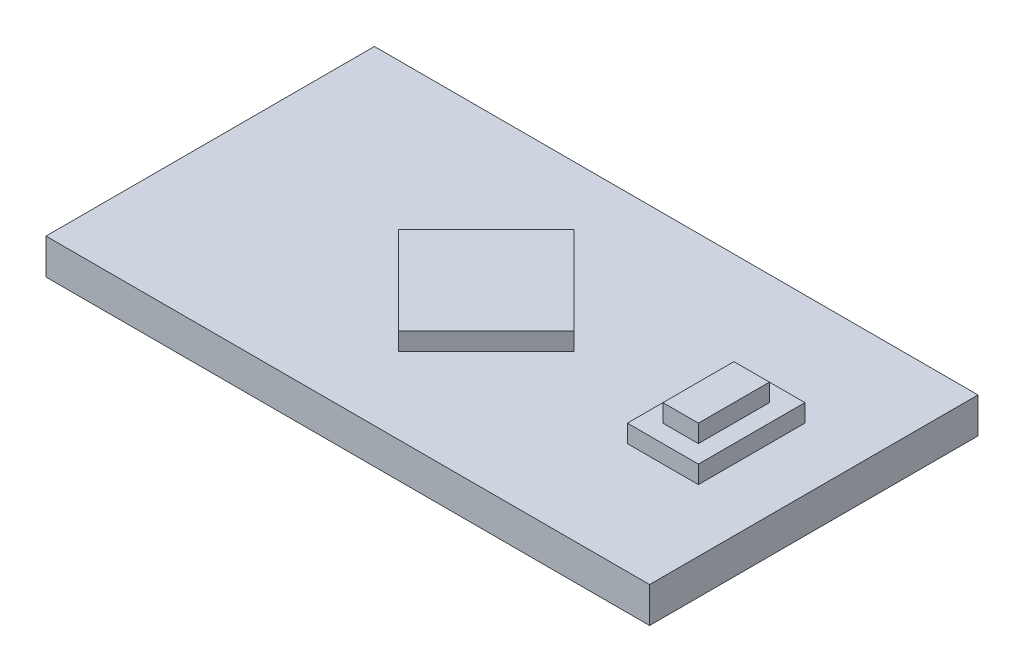
ISO-10303-21;
HEADER;
FILE_DESCRIPTION(('STEP AP214'),'2;1');
FILE_NAME('part.step','',(''),(''),'','','');
FILE_SCHEMA(('AUTOMOTIVE_DESIGN { 1 0 10303 214 1 1 1 1 }'));
ENDSEC;
DATA;
#1=APPLICATION_CONTEXT('core data for automotive mechanical design processes');
#2=APPLICATION_PROTOCOL_DEFINITION('international standard','automotive_design',2000,#1);
#3=PRODUCT_CONTEXT('',#1,'mechanical');
#4=PRODUCT('Part','Part','',(#3));
#5=PRODUCT_RELATED_PRODUCT_CATEGORY('part','',(#4));
#6=PRODUCT_DEFINITION_FORMATION('','',#4);
#7=PRODUCT_DEFINITION_CONTEXT('part definition',#1,'design');
#8=PRODUCT_DEFINITION('design','',#6,#7);
#9=PRODUCT_DEFINITION_SHAPE('','',#8);
#10=(LENGTH_UNIT() NAMED_UNIT(*) SI_UNIT(.MILLI.,.METRE.));
#11=(NAMED_UNIT(*) PLANE_ANGLE_UNIT() SI_UNIT($,.RADIAN.));
#12=(NAMED_UNIT(*) SI_UNIT($,.STERADIAN.) SOLID_ANGLE_UNIT());
#13=UNCERTAINTY_MEASURE_WITH_UNIT(LENGTH_MEASURE(1.E-05),#10,'distance_accuracy_value','');
#14=(GEOMETRIC_REPRESENTATION_CONTEXT(3) GLOBAL_UNCERTAINTY_ASSIGNED_CONTEXT((#13)) GLOBAL_UNIT_ASSIGNED_CONTEXT((#10,
#11,#12)) REPRESENTATION_CONTEXT('',''));
#15=CARTESIAN_POINT('',(0.,0.,0.));
#16=DIRECTION('',(0.,0.,1.));
#17=DIRECTION('',(1.,0.,0.));
#18=AXIS2_PLACEMENT_3D('',#15,#16,#17);
#19=CARTESIAN_POINT('',(0.,2.,0.));
#20=DIRECTION('',(0.,-1.,0.));
#21=DIRECTION('',(0.,0.,-1.));
#22=AXIS2_PLACEMENT_3D('',#19,#20,#21);
#23=PLANE('',#22);
#24=DIRECTION('',(0.,0.,-1.));
#25=VECTOR('',#24,1.);
#26=CARTESIAN_POINT('',(13.5,2.,-3.));
#27=LINE('',#26,#25);
#28=CARTESIAN_POINT('',(13.5,2.,3.));
#29=VERTEX_POINT('',#28);
#30=CARTESIAN_POINT('',(13.5,2.,-3.));
#31=VERTEX_POINT('',#30);
#32=EDGE_CURVE('E207',#29,#31,#27,.T.);
#33=ORIENTED_EDGE('',*,*,#32,.F.);
#34=DIRECTION('',(1.,0.,0.));
#35=VECTOR('',#34,1.);
#36=CARTESIAN_POINT('',(13.5,2.,3.));
#37=LINE('',#36,#35);
#38=CARTESIAN_POINT('',(9.5,2.,3.));
#39=VERTEX_POINT('',#38);
#40=EDGE_CURVE('E212',#39,#29,#37,.T.);
#41=ORIENTED_EDGE('',*,*,#40,.F.);
#42=DIRECTION('',(0.,0.,1.));
#43=VECTOR('',#42,1.);
#44=CARTESIAN_POINT('',(9.5,2.,-3.));
#45=LINE('',#44,#43);
#46=CARTESIAN_POINT('',(9.5,2.,-3.));
#47=VERTEX_POINT('',#46);
#48=EDGE_CURVE('E224',#47,#39,#45,.T.);
#49=ORIENTED_EDGE('',*,*,#48,.F.);
#50=DIRECTION('',(-1.,0.,0.));
#51=VECTOR('',#50,1.);
#52=CARTESIAN_POINT('',(13.5,2.,-3.));
#53=LINE('',#52,#51);
#54=EDGE_CURVE('E221',#31,#47,#53,.T.);
#55=ORIENTED_EDGE('',*,*,#54,.F.);
#56=EDGE_LOOP('',(#33,#41,#49,#55));
#57=FACE_BOUND('',#56,.T.);
#58=DIRECTION('',(0.,0.,1.));
#59=VECTOR('',#58,1.);
#60=CARTESIAN_POINT('',(-17.,2.,9.25));
#61=LINE('',#60,#59);
#62=CARTESIAN_POINT('',(-17.,2.,-9.25));
#63=VERTEX_POINT('',#62);
#64=CARTESIAN_POINT('',(-17.,2.,9.25));
#65=VERTEX_POINT('',#64);
#66=EDGE_CURVE('E241',#63,#65,#61,.T.);
#67=ORIENTED_EDGE('',*,*,#66,.T.);
#68=DIRECTION('',(1.,0.,0.));
#69=VECTOR('',#68,1.);
#70=CARTESIAN_POINT('',(-17.,2.,9.25));
#71=LINE('',#70,#69);
#72=CARTESIAN_POINT('',(17.,2.,9.25));
#73=VERTEX_POINT('',#72);
#74=EDGE_CURVE('E244',#65,#73,#71,.T.);
#75=ORIENTED_EDGE('',*,*,#74,.T.);
#76=DIRECTION('',(0.,0.,-1.));
#77=VECTOR('',#76,1.);
#78=CARTESIAN_POINT('',(17.,2.,9.25));
#79=LINE('',#78,#77);
#80=CARTESIAN_POINT('',(17.,2.,-9.25));
#81=VERTEX_POINT('',#80);
#82=EDGE_CURVE('E247',#73,#81,#79,.T.);
#83=ORIENTED_EDGE('',*,*,#82,.T.);
#84=DIRECTION('',(-1.,0.,0.));
#85=VECTOR('',#84,1.);
#86=CARTESIAN_POINT('',(-17.,2.,-9.25));
#87=LINE('',#86,#85);
#88=EDGE_CURVE('E249',#81,#63,#87,.T.);
#89=ORIENTED_EDGE('',*,*,#88,.T.);
#90=EDGE_LOOP('',(#67,#75,#83,#89));
#91=FACE_BOUND('',#90,.T.);
#92=DIRECTION('',(0.707106781186547,0.,-0.707106781186548));
#93=VECTOR('',#92,1.);
#94=CARTESIAN_POINT('',(3.5,2.,0.));
#95=LINE('',#94,#93);
#96=CARTESIAN_POINT('',(-1.44974746830583,2.,4.94974746830583));
#97=VERTEX_POINT('',#96);
#98=CARTESIAN_POINT('',(3.5,2.,0.));
#99=VERTEX_POINT('',#98);
#100=EDGE_CURVE('E168',#97,#99,#95,.T.);
#101=ORIENTED_EDGE('',*,*,#100,.F.);
#102=DIRECTION('',(0.707106781186548,0.,0.707106781186548));
#103=VECTOR('',#102,1.);
#104=CARTESIAN_POINT('',(-1.44974746830583,2.,4.94974746830583));
#105=LINE('',#104,#103);
#106=CARTESIAN_POINT('',(-6.39949493661166,2.,0.));
#107=VERTEX_POINT('',#106);
#108=EDGE_CURVE('E165',#107,#97,#105,.T.);
#109=ORIENTED_EDGE('',*,*,#108,.F.);
#110=DIRECTION('',(-0.707106781186547,0.,0.707106781186548));
#111=VECTOR('',#110,1.);
#112=CARTESIAN_POINT('',(-1.44974746830583,2.,-4.94974746830584));
#113=LINE('',#112,#111);
#114=CARTESIAN_POINT('',(-1.44974746830583,2.,-4.94974746830583));
#115=VERTEX_POINT('',#114);
#116=EDGE_CURVE('E55',#115,#107,#113,.T.);
#117=ORIENTED_EDGE('',*,*,#116,.F.);
#118=DIRECTION('',(-0.707106781186548,0.,-0.707106781186548));
#119=VECTOR('',#118,1.);
#120=CARTESIAN_POINT('',(3.5,2.,0.));
#121=LINE('',#120,#119);
#122=EDGE_CURVE('E50',#99,#115,#121,.T.);
#123=ORIENTED_EDGE('',*,*,#122,.F.);
#124=EDGE_LOOP('',(#101,#109,#117,#123));
#125=FACE_BOUND('',#124,.T.);
#126=ADVANCED_FACE('F35',(#57,#91,#125),#23,.F.);
#127=CARTESIAN_POINT('',(0.,3.,0.));
#128=DIRECTION('',(0.,-1.,0.));
#129=DIRECTION('',(0.,0.,-1.));
#130=AXIS2_PLACEMENT_3D('',#127,#128,#129);
#131=PLANE('',#130);
#132=DIRECTION('',(0.,0.,-1.));
#133=VECTOR('',#132,1.);
#134=CARTESIAN_POINT('',(13.5,3.,-3.));
#135=LINE('',#134,#133);
#136=CARTESIAN_POINT('',(13.5,3.,3.));
#137=VERTEX_POINT('',#136);
#138=CARTESIAN_POINT('',(13.5,3.,-3.));
#139=VERTEX_POINT('',#138);
#140=EDGE_CURVE('E208',#137,#139,#135,.T.);
#141=ORIENTED_EDGE('',*,*,#140,.T.);
#142=DIRECTION('',(-1.,0.,0.));
#143=VECTOR('',#142,1.);
#144=CARTESIAN_POINT('',(13.5,3.,-3.));
#145=LINE('',#144,#143);
#146=CARTESIAN_POINT('',(9.5,3.,-3.));
#147=VERTEX_POINT('',#146);
#148=EDGE_CURVE('E211',#139,#147,#145,.T.);
#149=ORIENTED_EDGE('',*,*,#148,.T.);
#150=DIRECTION('',(0.,0.,1.));
#151=VECTOR('',#150,1.);
#152=CARTESIAN_POINT('',(9.5,3.,-3.));
#153=LINE('',#152,#151);
#154=CARTESIAN_POINT('',(9.5,3.,3.));
#155=VERTEX_POINT('',#154);
#156=EDGE_CURVE('E214',#147,#155,#153,.T.);
#157=ORIENTED_EDGE('',*,*,#156,.T.);
#158=DIRECTION('',(1.,0.,0.));
#159=VECTOR('',#158,1.);
#160=CARTESIAN_POINT('',(13.5,3.,3.));
#161=LINE('',#160,#159);
#162=EDGE_CURVE('E216',#155,#137,#161,.T.);
#163=ORIENTED_EDGE('',*,*,#162,.T.);
#164=EDGE_LOOP('',(#141,#149,#157,#163));
#165=FACE_BOUND('',#164,.T.);
#166=DIRECTION('',(1.,0.,0.));
#167=VECTOR('',#166,1.);
#168=CARTESIAN_POINT('',(10.5,3.,2.));
#169=LINE('',#168,#167);
#170=CARTESIAN_POINT('',(10.5,3.,2.));
#171=VERTEX_POINT('',#170);
#172=CARTESIAN_POINT('',(12.5,3.,2.));
#173=VERTEX_POINT('',#172);
#174=EDGE_CURVE('E169',#171,#173,#169,.T.);
#175=ORIENTED_EDGE('',*,*,#174,.F.);
#176=DIRECTION('',(0.,0.,1.));
#177=VECTOR('',#176,1.);
#178=CARTESIAN_POINT('',(10.5,3.,-2.));
#179=LINE('',#178,#177);
#180=CARTESIAN_POINT('',(10.5,3.,-2.));
#181=VERTEX_POINT('',#180);
#182=EDGE_CURVE('E182',#181,#171,#179,.T.);
#183=ORIENTED_EDGE('',*,*,#182,.F.);
#184=DIRECTION('',(-1.,0.,0.));
#185=VECTOR('',#184,1.);
#186=CARTESIAN_POINT('',(12.5,3.,-2.));
#187=LINE('',#186,#185);
#188=CARTESIAN_POINT('',(12.5,3.,-2.));
#189=VERTEX_POINT('',#188);
#190=EDGE_CURVE('E191',#189,#181,#187,.T.);
#191=ORIENTED_EDGE('',*,*,#190,.F.);
#192=DIRECTION('',(0.,0.,-1.));
#193=VECTOR('',#192,1.);
#194=CARTESIAN_POINT('',(12.5,3.,2.));
#195=LINE('',#194,#193);
#196=EDGE_CURVE('E172',#173,#189,#195,.T.);
#197=ORIENTED_EDGE('',*,*,#196,.F.);
#198=EDGE_LOOP('',(#175,#183,#191,#197));
#199=FACE_BOUND('',#198,.T.);
#200=ADVANCED_FACE('F290',(#165,#199),#131,.F.);
#201=CARTESIAN_POINT('',(-17.,2.,9.25));
#202=DIRECTION('',(1.,0.,0.));
#203=DIRECTION('',(0.,0.,-1.));
#204=AXIS2_PLACEMENT_3D('',#201,#202,#203);
#205=PLANE('',#204);
#206=DIRECTION('',(0.,0.,1.));
#207=VECTOR('',#206,1.);
#208=CARTESIAN_POINT('',(-17.,0.,9.25));
#209=LINE('',#208,#207);
#210=CARTESIAN_POINT('',(-17.,0.,-9.25));
#211=VERTEX_POINT('',#210);
#212=CARTESIAN_POINT('',(-17.,0.,9.25));
#213=VERTEX_POINT('',#212);
#214=EDGE_CURVE('E240',#211,#213,#209,.T.);
#215=ORIENTED_EDGE('',*,*,#214,.T.);
#216=DIRECTION('',(0.,-1.,0.));
#217=VECTOR('',#216,1.);
#218=CARTESIAN_POINT('',(-17.,2.,9.25));
#219=LINE('',#218,#217);
#220=EDGE_CURVE('E11',#65,#213,#219,.T.);
#221=ORIENTED_EDGE('',*,*,#220,.F.);
#222=ORIENTED_EDGE('',*,*,#66,.F.);
#223=DIRECTION('',(0.,-1.,0.));
#224=VECTOR('',#223,1.);
#225=CARTESIAN_POINT('',(-17.,2.,-9.25));
#226=LINE('',#225,#224);
#227=EDGE_CURVE('E251',#63,#211,#226,.T.);
#228=ORIENTED_EDGE('',*,*,#227,.T.);
#229=EDGE_LOOP('',(#215,#221,#222,#228));
#230=FACE_BOUND('',#229,.T.);
#231=ADVANCED_FACE('F37',(#230),#205,.F.);
#232=CARTESIAN_POINT('',(-17.,2.,9.25));
#233=DIRECTION('',(0.,0.,-1.));
#234=DIRECTION('',(-1.,0.,0.));
#235=AXIS2_PLACEMENT_3D('',#232,#233,#234);
#236=PLANE('',#235);
#237=DIRECTION('',(1.,0.,0.));
#238=VECTOR('',#237,1.);
#239=CARTESIAN_POINT('',(-17.,0.,9.25));
#240=LINE('',#239,#238);
#241=CARTESIAN_POINT('',(17.,0.,9.25));
#242=VERTEX_POINT('',#241);
#243=EDGE_CURVE('E254',#213,#242,#240,.T.);
#244=ORIENTED_EDGE('',*,*,#243,.T.);
#245=DIRECTION('',(0.,-1.,0.));
#246=VECTOR('',#245,1.);
#247=CARTESIAN_POINT('',(17.,2.,9.25));
#248=LINE('',#247,#246);
#249=EDGE_CURVE('E43',#73,#242,#248,.T.);
#250=ORIENTED_EDGE('',*,*,#249,.F.);
#251=ORIENTED_EDGE('',*,*,#74,.F.);
#252=ORIENTED_EDGE('',*,*,#220,.T.);
#253=EDGE_LOOP('',(#244,#250,#251,#252));
#254=FACE_BOUND('',#253,.T.);
#255=ADVANCED_FACE('F283',(#254),#236,.F.);
#256=CARTESIAN_POINT('',(17.,2.,9.25));
#257=DIRECTION('',(-1.,0.,0.));
#258=DIRECTION('',(0.,0.,1.));
#259=AXIS2_PLACEMENT_3D('',#256,#257,#258);
#260=PLANE('',#259);
#261=DIRECTION('',(0.,0.,-1.));
#262=VECTOR('',#261,1.);
#263=CARTESIAN_POINT('',(17.,0.,9.25));
#264=LINE('',#263,#262);
#265=CARTESIAN_POINT('',(17.,0.,-9.25));
#266=VERTEX_POINT('',#265);
#267=EDGE_CURVE('E256',#242,#266,#264,.T.);
#268=ORIENTED_EDGE('',*,*,#267,.T.);
#269=DIRECTION('',(0.,-1.,0.));
#270=VECTOR('',#269,1.);
#271=CARTESIAN_POINT('',(17.,2.,-9.25));
#272=LINE('',#271,#270);
#273=EDGE_CURVE('E261',#81,#266,#272,.T.);
#274=ORIENTED_EDGE('',*,*,#273,.F.);
#275=ORIENTED_EDGE('',*,*,#82,.F.);
#276=ORIENTED_EDGE('',*,*,#249,.T.);
#277=EDGE_LOOP('',(#268,#274,#275,#276));
#278=FACE_BOUND('',#277,.T.);
#279=ADVANCED_FACE('F268',(#278),#260,.F.);
#280=CARTESIAN_POINT('',(-17.,2.,-9.25));
#281=DIRECTION('',(0.,0.,1.));
#282=DIRECTION('',(1.,0.,0.));
#283=AXIS2_PLACEMENT_3D('',#280,#281,#282);
#284=PLANE('',#283);
#285=DIRECTION('',(-1.,0.,0.));
#286=VECTOR('',#285,1.);
#287=CARTESIAN_POINT('',(-17.,0.,-9.25));
#288=LINE('',#287,#286);
#289=EDGE_CURVE('E245',#266,#211,#288,.T.);
#290=ORIENTED_EDGE('',*,*,#289,.T.);
#291=ORIENTED_EDGE('',*,*,#227,.F.);
#292=ORIENTED_EDGE('',*,*,#88,.F.);
#293=ORIENTED_EDGE('',*,*,#273,.T.);
#294=EDGE_LOOP('',(#290,#291,#292,#293));
#295=FACE_BOUND('',#294,.T.);
#296=ADVANCED_FACE('F277',(#295),#284,.F.);
#297=CARTESIAN_POINT('',(0.,0.,0.));
#298=DIRECTION('',(0.,-1.,0.));
#299=DIRECTION('',(0.,0.,-1.));
#300=AXIS2_PLACEMENT_3D('',#297,#298,#299);
#301=PLANE('',#300);
#302=ORIENTED_EDGE('',*,*,#214,.F.);
#303=ORIENTED_EDGE('',*,*,#289,.F.);
#304=ORIENTED_EDGE('',*,*,#267,.F.);
#305=ORIENTED_EDGE('',*,*,#243,.F.);
#306=EDGE_LOOP('',(#302,#303,#304,#305));
#307=FACE_BOUND('',#306,.T.);
#308=ADVANCED_FACE('F274',(#307),#301,.T.);
#309=CARTESIAN_POINT('',(13.5,3.,-3.));
#310=DIRECTION('',(-1.,0.,0.));
#311=DIRECTION('',(0.,0.,1.));
#312=AXIS2_PLACEMENT_3D('',#309,#310,#311);
#313=PLANE('',#312);
#314=ORIENTED_EDGE('',*,*,#32,.T.);
#315=DIRECTION('',(0.,-1.,0.));
#316=VECTOR('',#315,1.);
#317=CARTESIAN_POINT('',(13.5,3.,-3.));
#318=LINE('',#317,#316);
#319=EDGE_CURVE('E237',#139,#31,#318,.T.);
#320=ORIENTED_EDGE('',*,*,#319,.F.);
#321=ORIENTED_EDGE('',*,*,#140,.F.);
#322=DIRECTION('',(0.,-1.,0.));
#323=VECTOR('',#322,1.);
#324=CARTESIAN_POINT('',(13.5,3.,3.));
#325=LINE('',#324,#323);
#326=EDGE_CURVE('E218',#137,#29,#325,.T.);
#327=ORIENTED_EDGE('',*,*,#326,.T.);
#328=EDGE_LOOP('',(#314,#320,#321,#327));
#329=FACE_BOUND('',#328,.T.);
#330=ADVANCED_FACE('F301',(#329),#313,.F.);
#331=CARTESIAN_POINT('',(13.5,3.,-3.));
#332=DIRECTION('',(0.,0.,1.));
#333=DIRECTION('',(1.,0.,0.));
#334=AXIS2_PLACEMENT_3D('',#331,#332,#333);
#335=PLANE('',#334);
#336=ORIENTED_EDGE('',*,*,#54,.T.);
#337=DIRECTION('',(0.,-1.,0.));
#338=VECTOR('',#337,1.);
#339=CARTESIAN_POINT('',(9.5,3.,-3.));
#340=LINE('',#339,#338);
#341=EDGE_CURVE('E234',#147,#47,#340,.T.);
#342=ORIENTED_EDGE('',*,*,#341,.F.);
#343=ORIENTED_EDGE('',*,*,#148,.F.);
#344=ORIENTED_EDGE('',*,*,#319,.T.);
#345=EDGE_LOOP('',(#336,#342,#343,#344));
#346=FACE_BOUND('',#345,.T.);
#347=ADVANCED_FACE('F320',(#346),#335,.F.);
#348=CARTESIAN_POINT('',(9.5,3.,-3.));
#349=DIRECTION('',(1.,0.,0.));
#350=DIRECTION('',(0.,0.,-1.));
#351=AXIS2_PLACEMENT_3D('',#348,#349,#350);
#352=PLANE('',#351);
#353=ORIENTED_EDGE('',*,*,#48,.T.);
#354=DIRECTION('',(0.,-1.,0.));
#355=VECTOR('',#354,1.);
#356=CARTESIAN_POINT('',(9.5,3.,3.));
#357=LINE('',#356,#355);
#358=EDGE_CURVE('E231',#155,#39,#357,.T.);
#359=ORIENTED_EDGE('',*,*,#358,.F.);
#360=ORIENTED_EDGE('',*,*,#156,.F.);
#361=ORIENTED_EDGE('',*,*,#341,.T.);
#362=EDGE_LOOP('',(#353,#359,#360,#361));
#363=FACE_BOUND('',#362,.T.);
#364=ADVANCED_FACE('F328',(#363),#352,.F.);
#365=CARTESIAN_POINT('',(13.5,3.,3.));
#366=DIRECTION('',(0.,0.,-1.));
#367=DIRECTION('',(-1.,0.,0.));
#368=AXIS2_PLACEMENT_3D('',#365,#366,#367);
#369=PLANE('',#368);
#370=ORIENTED_EDGE('',*,*,#40,.T.);
#371=ORIENTED_EDGE('',*,*,#326,.F.);
#372=ORIENTED_EDGE('',*,*,#162,.F.);
#373=ORIENTED_EDGE('',*,*,#358,.T.);
#374=EDGE_LOOP('',(#370,#371,#372,#373));
#375=FACE_BOUND('',#374,.T.);
#376=ADVANCED_FACE('F336',(#375),#369,.F.);
#377=CARTESIAN_POINT('',(10.5,4.,2.));
#378=DIRECTION('',(0.,0.,-1.));
#379=DIRECTION('',(-1.,0.,0.));
#380=AXIS2_PLACEMENT_3D('',#377,#378,#379);
#381=PLANE('',#380);
#382=ORIENTED_EDGE('',*,*,#174,.T.);
#383=DIRECTION('',(0.,-1.,0.));
#384=VECTOR('',#383,1.);
#385=CARTESIAN_POINT('',(12.5,4.,2.));
#386=LINE('',#385,#384);
#387=CARTESIAN_POINT('',(12.5,4.,2.));
#388=VERTEX_POINT('',#387);
#389=EDGE_CURVE('E204',#388,#173,#386,.T.);
#390=ORIENTED_EDGE('',*,*,#389,.F.);
#391=DIRECTION('',(1.,0.,0.));
#392=VECTOR('',#391,1.);
#393=CARTESIAN_POINT('',(10.5,4.,2.));
#394=LINE('',#393,#392);
#395=CARTESIAN_POINT('',(10.5,4.,2.));
#396=VERTEX_POINT('',#395);
#397=EDGE_CURVE('E178',#396,#388,#394,.T.);
#398=ORIENTED_EDGE('',*,*,#397,.F.);
#399=DIRECTION('',(0.,-1.,0.));
#400=VECTOR('',#399,1.);
#401=CARTESIAN_POINT('',(10.5,4.,2.));
#402=LINE('',#401,#400);
#403=EDGE_CURVE('E187',#396,#171,#402,.T.);
#404=ORIENTED_EDGE('',*,*,#403,.T.);
#405=EDGE_LOOP('',(#382,#390,#398,#404));
#406=FACE_BOUND('',#405,.T.);
#407=ADVANCED_FACE('F344',(#406),#381,.F.);
#408=CARTESIAN_POINT('',(12.5,4.,2.));
#409=DIRECTION('',(-1.,0.,0.));
#410=DIRECTION('',(0.,0.,1.));
#411=AXIS2_PLACEMENT_3D('',#408,#409,#410);
#412=PLANE('',#411);
#413=ORIENTED_EDGE('',*,*,#196,.T.);
#414=DIRECTION('',(0.,-1.,0.));
#415=VECTOR('',#414,1.);
#416=CARTESIAN_POINT('',(12.5,4.,-2.));
#417=LINE('',#416,#415);
#418=CARTESIAN_POINT('',(12.5,4.,-2.));
#419=VERTEX_POINT('',#418);
#420=EDGE_CURVE('E201',#419,#189,#417,.T.);
#421=ORIENTED_EDGE('',*,*,#420,.F.);
#422=DIRECTION('',(0.,0.,-1.));
#423=VECTOR('',#422,1.);
#424=CARTESIAN_POINT('',(12.5,4.,2.));
#425=LINE('',#424,#423);
#426=EDGE_CURVE('E181',#388,#419,#425,.T.);
#427=ORIENTED_EDGE('',*,*,#426,.F.);
#428=ORIENTED_EDGE('',*,*,#389,.T.);
#429=EDGE_LOOP('',(#413,#421,#427,#428));
#430=FACE_BOUND('',#429,.T.);
#431=ADVANCED_FACE('F352',(#430),#412,.F.);
#432=CARTESIAN_POINT('',(12.5,4.,-2.));
#433=DIRECTION('',(0.,0.,1.));
#434=DIRECTION('',(1.,0.,0.));
#435=AXIS2_PLACEMENT_3D('',#432,#433,#434);
#436=PLANE('',#435);
#437=ORIENTED_EDGE('',*,*,#190,.T.);
#438=DIRECTION('',(0.,-1.,0.));
#439=VECTOR('',#438,1.);
#440=CARTESIAN_POINT('',(10.5,4.,-2.));
#441=LINE('',#440,#439);
#442=CARTESIAN_POINT('',(10.5,4.,-2.));
#443=VERTEX_POINT('',#442);
#444=EDGE_CURVE('E198',#443,#181,#441,.T.);
#445=ORIENTED_EDGE('',*,*,#444,.F.);
#446=DIRECTION('',(-1.,0.,0.));
#447=VECTOR('',#446,1.);
#448=CARTESIAN_POINT('',(12.5,4.,-2.));
#449=LINE('',#448,#447);
#450=EDGE_CURVE('E184',#419,#443,#449,.T.);
#451=ORIENTED_EDGE('',*,*,#450,.F.);
#452=ORIENTED_EDGE('',*,*,#420,.T.);
#453=EDGE_LOOP('',(#437,#445,#451,#452));
#454=FACE_BOUND('',#453,.T.);
#455=ADVANCED_FACE('F362',(#454),#436,.F.);
#456=CARTESIAN_POINT('',(10.5,4.,-2.));
#457=DIRECTION('',(1.,0.,0.));
#458=DIRECTION('',(0.,0.,-1.));
#459=AXIS2_PLACEMENT_3D('',#456,#457,#458);
#460=PLANE('',#459);
#461=ORIENTED_EDGE('',*,*,#182,.T.);
#462=ORIENTED_EDGE('',*,*,#403,.F.);
#463=DIRECTION('',(0.,0.,1.));
#464=VECTOR('',#463,1.);
#465=CARTESIAN_POINT('',(10.5,4.,-2.));
#466=LINE('',#465,#464);
#467=EDGE_CURVE('E186',#443,#396,#466,.T.);
#468=ORIENTED_EDGE('',*,*,#467,.F.);
#469=ORIENTED_EDGE('',*,*,#444,.T.);
#470=EDGE_LOOP('',(#461,#462,#468,#469));
#471=FACE_BOUND('',#470,.T.);
#472=ADVANCED_FACE('F370',(#471),#460,.F.);
#473=CARTESIAN_POINT('',(0.,4.,0.));
#474=DIRECTION('',(0.,1.,0.));
#475=DIRECTION('',(0.,0.,1.));
#476=AXIS2_PLACEMENT_3D('',#473,#474,#475);
#477=PLANE('',#476);
#478=ORIENTED_EDGE('',*,*,#397,.T.);
#479=ORIENTED_EDGE('',*,*,#426,.T.);
#480=ORIENTED_EDGE('',*,*,#450,.T.);
#481=ORIENTED_EDGE('',*,*,#467,.T.);
#482=EDGE_LOOP('',(#478,#479,#480,#481));
#483=FACE_BOUND('',#482,.T.);
#484=ADVANCED_FACE('F377',(#483),#477,.T.);
#485=CARTESIAN_POINT('',(3.5,3.,0.));
#486=DIRECTION('',(-0.707106781186548,0.,-0.707106781186547));
#487=DIRECTION('',(-0.707106781186547,0.,0.707106781186548));
#488=AXIS2_PLACEMENT_3D('',#485,#486,#487);
#489=PLANE('',#488);
#490=ORIENTED_EDGE('',*,*,#100,.T.);
#491=DIRECTION('',(0.,-1.,0.));
#492=VECTOR('',#491,1.);
#493=CARTESIAN_POINT('',(3.5,3.,0.));
#494=LINE('',#493,#492);
#495=CARTESIAN_POINT('',(3.5,3.,0.));
#496=VERTEX_POINT('',#495);
#497=EDGE_CURVE('E149',#496,#99,#494,.T.);
#498=ORIENTED_EDGE('',*,*,#497,.F.);
#499=DIRECTION('',(0.707106781186547,0.,-0.707106781186548));
#500=VECTOR('',#499,1.);
#501=CARTESIAN_POINT('',(3.5,3.,0.));
#502=LINE('',#501,#500);
#503=CARTESIAN_POINT('',(-1.44974746830583,3.,4.94974746830583));
#504=VERTEX_POINT('',#503);
#505=EDGE_CURVE('E156',#504,#496,#502,.T.);
#506=ORIENTED_EDGE('',*,*,#505,.F.);
#507=DIRECTION('',(0.,-1.,0.));
#508=VECTOR('',#507,1.);
#509=CARTESIAN_POINT('',(-1.44974746830583,3.,4.94974746830583));
#510=LINE('',#509,#508);
#511=EDGE_CURVE('E519',#504,#97,#510,.T.);
#512=ORIENTED_EDGE('',*,*,#511,.T.);
#513=EDGE_LOOP('',(#490,#498,#506,#512));
#514=FACE_BOUND('',#513,.T.);
#515=ADVANCED_FACE('F167',(#514),#489,.F.);
#516=CARTESIAN_POINT('',(3.5,3.,0.));
#517=DIRECTION('',(-0.707106781186547,0.,0.707106781186547));
#518=DIRECTION('',(0.707106781186548,0.,0.707106781186548));
#519=AXIS2_PLACEMENT_3D('',#516,#517,#518);
#520=PLANE('',#519);
#521=ORIENTED_EDGE('',*,*,#122,.T.);
#522=DIRECTION('',(0.,-1.,0.));
#523=VECTOR('',#522,1.);
#524=CARTESIAN_POINT('',(-1.44974746830583,3.,-4.94974746830584));
#525=LINE('',#524,#523);
#526=CARTESIAN_POINT('',(-1.44974746830583,3.,-4.94974746830584));
#527=VERTEX_POINT('',#526);
#528=EDGE_CURVE('E152',#527,#115,#525,.T.);
#529=ORIENTED_EDGE('',*,*,#528,.F.);
#530=DIRECTION('',(-0.707106781186548,0.,-0.707106781186548));
#531=VECTOR('',#530,1.);
#532=CARTESIAN_POINT('',(3.5,3.,0.));
#533=LINE('',#532,#531);
#534=EDGE_CURVE('E145',#496,#527,#533,.T.);
#535=ORIENTED_EDGE('',*,*,#534,.F.);
#536=ORIENTED_EDGE('',*,*,#497,.T.);
#537=EDGE_LOOP('',(#521,#529,#535,#536));
#538=FACE_BOUND('',#537,.T.);
#539=ADVANCED_FACE('F147',(#538),#520,.F.);
#540=CARTESIAN_POINT('',(-1.44974746830583,3.,-4.94974746830584));
#541=DIRECTION('',(0.707106781186548,0.,0.707106781186547));
#542=DIRECTION('',(0.707106781186547,0.,-0.707106781186548));
#543=AXIS2_PLACEMENT_3D('',#540,#541,#542);
#544=PLANE('',#543);
#545=ORIENTED_EDGE('',*,*,#116,.T.);
#546=DIRECTION('',(0.,-1.,0.));
#547=VECTOR('',#546,1.);
#548=CARTESIAN_POINT('',(-6.39949493661166,3.,0.));
#549=LINE('',#548,#547);
#550=CARTESIAN_POINT('',(-6.39949493661166,3.,0.));
#551=VERTEX_POINT('',#550);
#552=EDGE_CURVE('E174',#551,#107,#549,.T.);
#553=ORIENTED_EDGE('',*,*,#552,.F.);
#554=DIRECTION('',(-0.707106781186547,0.,0.707106781186548));
#555=VECTOR('',#554,1.);
#556=CARTESIAN_POINT('',(-1.44974746830583,3.,-4.94974746830584));
#557=LINE('',#556,#555);
#558=EDGE_CURVE('E155',#527,#551,#557,.T.);
#559=ORIENTED_EDGE('',*,*,#558,.F.);
#560=ORIENTED_EDGE('',*,*,#528,.T.);
#561=EDGE_LOOP('',(#545,#553,#559,#560));
#562=FACE_BOUND('',#561,.T.);
#563=ADVANCED_FACE('F399',(#562),#544,.F.);
#564=CARTESIAN_POINT('',(-1.44974746830583,3.,4.94974746830583));
#565=DIRECTION('',(0.707106781186547,0.,-0.707106781186548));
#566=DIRECTION('',(-0.707106781186548,0.,-0.707106781186547));
#567=AXIS2_PLACEMENT_3D('',#564,#565,#566);
#568=PLANE('',#567);
#569=ORIENTED_EDGE('',*,*,#108,.T.);
#570=ORIENTED_EDGE('',*,*,#511,.F.);
#571=DIRECTION('',(0.707106781186548,0.,0.707106781186548));
#572=VECTOR('',#571,1.);
#573=CARTESIAN_POINT('',(-1.44974746830583,3.,4.94974746830583));
#574=LINE('',#573,#572);
#575=EDGE_CURVE('E161',#551,#504,#574,.T.);
#576=ORIENTED_EDGE('',*,*,#575,.F.);
#577=ORIENTED_EDGE('',*,*,#552,.T.);
#578=EDGE_LOOP('',(#569,#570,#576,#577));
#579=FACE_BOUND('',#578,.T.);
#580=ADVANCED_FACE('F405',(#579),#568,.F.);
#581=CARTESIAN_POINT('',(0.,3.,0.));
#582=DIRECTION('',(0.,-1.,0.));
#583=DIRECTION('',(0.,0.,-1.));
#584=AXIS2_PLACEMENT_3D('',#581,#582,#583);
#585=PLANE('',#584);
#586=ORIENTED_EDGE('',*,*,#505,.T.);
#587=ORIENTED_EDGE('',*,*,#534,.T.);
#588=ORIENTED_EDGE('',*,*,#558,.T.);
#589=ORIENTED_EDGE('',*,*,#575,.T.);
#590=EDGE_LOOP('',(#586,#587,#588,#589));
#591=FACE_BOUND('',#590,.T.);
#592=ADVANCED_FACE('F159',(#591),#585,.F.);
#593=CLOSED_SHELL('',(#126,#200,#231,#255,#279,#296,#308,#330,#347,#364,#376,#407,#431,#455,
#472,#484,#515,#539,#563,#580,#592));
#594=MANIFOLD_SOLID_BREP('B2',#593);
#595=ADVANCED_BREP_SHAPE_REPRESENTATION('',(#18,#594),#14);
#596=SHAPE_DEFINITION_REPRESENTATION(#9,#595);
ENDSEC;
END-ISO-10303-21;
